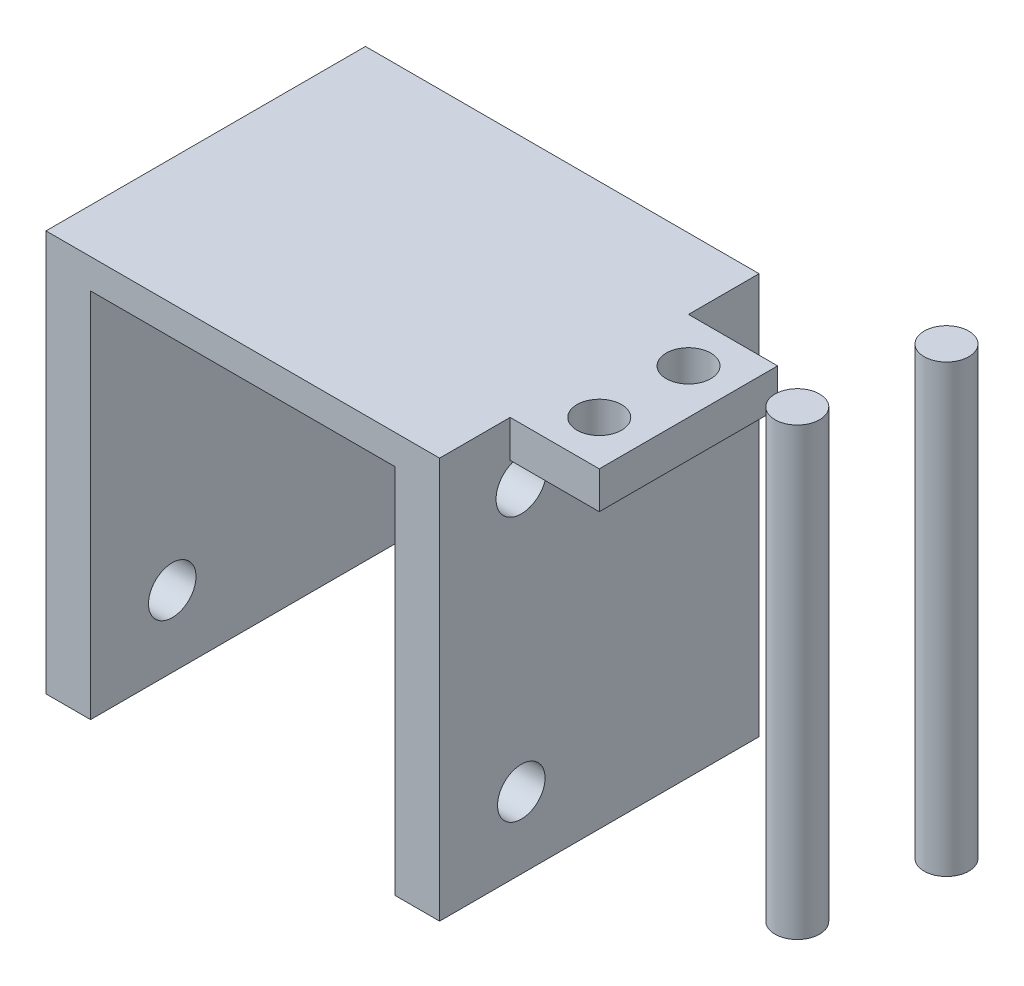
ISO-10303-21;
HEADER;
FILE_DESCRIPTION(('STEP AP214'),'2;1');
FILE_NAME('part.step','',(''),(''),'','','');
FILE_SCHEMA(('AUTOMOTIVE_DESIGN { 1 0 10303 214 1 1 1 1 }'));
ENDSEC;
DATA;
#1=APPLICATION_CONTEXT('core data for automotive mechanical design processes');
#2=APPLICATION_PROTOCOL_DEFINITION('international standard','automotive_design',2000,#1);
#3=PRODUCT_CONTEXT('',#1,'mechanical');
#4=PRODUCT('Part','Part','',(#3));
#5=PRODUCT_RELATED_PRODUCT_CATEGORY('part','',(#4));
#6=PRODUCT_DEFINITION_FORMATION('','',#4);
#7=PRODUCT_DEFINITION_CONTEXT('part definition',#1,'design');
#8=PRODUCT_DEFINITION('design','',#6,#7);
#9=PRODUCT_DEFINITION_SHAPE('','',#8);
#10=(LENGTH_UNIT() NAMED_UNIT(*) SI_UNIT(.MILLI.,.METRE.));
#11=(NAMED_UNIT(*) PLANE_ANGLE_UNIT() SI_UNIT($,.RADIAN.));
#12=(NAMED_UNIT(*) SI_UNIT($,.STERADIAN.) SOLID_ANGLE_UNIT());
#13=UNCERTAINTY_MEASURE_WITH_UNIT(LENGTH_MEASURE(1.E-05),#10,'distance_accuracy_value','');
#14=(GEOMETRIC_REPRESENTATION_CONTEXT(3) GLOBAL_UNCERTAINTY_ASSIGNED_CONTEXT((#13)) GLOBAL_UNIT_ASSIGNED_CONTEXT((#10,
#11,#12)) REPRESENTATION_CONTEXT('',''));
#15=CARTESIAN_POINT('',(0.,0.,0.));
#16=DIRECTION('',(0.,0.,1.));
#17=DIRECTION('',(1.,0.,0.));
#18=AXIS2_PLACEMENT_3D('',#15,#16,#17);
#19=CARTESIAN_POINT('',(-63.946767990082,-37.9640136599524,21.6698122934481));
#20=DIRECTION('',(0.,1.,0.));
#21=DIRECTION('',(-1.,0.,0.));
#22=AXIS2_PLACEMENT_3D('',#19,#20,#21);
#23=CYLINDRICAL_SURFACE('',#22,1.5);
#24=CARTESIAN_POINT('',(-63.946767990082,-37.9640136599524,21.6698122934481));
#25=DIRECTION('',(0.,1.,0.));
#26=DIRECTION('',(-1.,0.,0.));
#27=AXIS2_PLACEMENT_3D('',#24,#25,#26);
#28=CIRCLE('',#27,1.5);
#29=CARTESIAN_POINT('',(-65.446767990082,-37.9640136599524,21.6698122934481));
#30=VERTEX_POINT('',#29);
#31=EDGE_CURVE('E54',#30,#30,#28,.T.);
#32=ORIENTED_EDGE('',*,*,#31,.T.);
#33=EDGE_LOOP('',(#32));
#34=FACE_BOUND('',#33,.T.);
#35=CARTESIAN_POINT('',(-63.946767990082,-7.96401365995245,21.6698122934481));
#36=DIRECTION('',(0.,1.,0.));
#37=DIRECTION('',(-1.,0.,0.));
#38=AXIS2_PLACEMENT_3D('',#35,#36,#37);
#39=CIRCLE('',#38,1.5);
#40=CARTESIAN_POINT('',(-65.446767990082,-7.96401365995245,21.6698122934481));
#41=VERTEX_POINT('',#40);
#42=EDGE_CURVE('E11',#41,#41,#39,.T.);
#43=ORIENTED_EDGE('',*,*,#42,.F.);
#44=EDGE_LOOP('',(#43));
#45=FACE_BOUND('',#44,.T.);
#46=ADVANCED_FACE('F50',(#34,#45),#23,.T.);
#47=CARTESIAN_POINT('',(-63.946767990082,-37.9640136599524,21.6698122934481));
#48=DIRECTION('',(0.,1.,0.));
#49=DIRECTION('',(-1.,0.,0.));
#50=AXIS2_PLACEMENT_3D('',#47,#48,#49);
#51=PLANE('',#50);
#52=ORIENTED_EDGE('',*,*,#31,.F.);
#53=EDGE_LOOP('',(#52));
#54=FACE_BOUND('',#53,.T.);
#55=ADVANCED_FACE('F52',(#54),#51,.F.);
#56=CARTESIAN_POINT('',(-63.946767990082,-7.96401365995245,21.6698122934481));
#57=DIRECTION('',(0.,1.,0.));
#58=DIRECTION('',(-1.,0.,0.));
#59=AXIS2_PLACEMENT_3D('',#56,#57,#58);
#60=PLANE('',#59);
#61=ORIENTED_EDGE('',*,*,#42,.T.);
#62=EDGE_LOOP('',(#61));
#63=FACE_BOUND('',#62,.T.);
#64=ADVANCED_FACE('F68',(#63),#60,.T.);
#65=CLOSED_SHELL('',(#46,#55,#64));
#66=MANIFOLD_SOLID_BREP('B2',#65);
#67=CARTESIAN_POINT('',(-62.5970607031139,-37.9640136599524,12.9739899007783));
#68=DIRECTION('',(0.,1.,0.));
#69=DIRECTION('',(-1.,0.,0.));
#70=AXIS2_PLACEMENT_3D('',#67,#68,#69);
#71=CYLINDRICAL_SURFACE('',#70,1.5);
#72=CARTESIAN_POINT('',(-62.5970607031139,-37.9640136599524,12.9739899007783));
#73=DIRECTION('',(0.,1.,0.));
#74=DIRECTION('',(-1.,0.,0.));
#75=AXIS2_PLACEMENT_3D('',#72,#73,#74);
#76=CIRCLE('',#75,1.5);
#77=CARTESIAN_POINT('',(-64.0970607031139,-37.9640136599524,12.9739899007783));
#78=VERTEX_POINT('',#77);
#79=EDGE_CURVE('E49',#78,#78,#76,.T.);
#80=ORIENTED_EDGE('',*,*,#79,.T.);
#81=EDGE_LOOP('',(#80));
#82=FACE_BOUND('',#81,.T.);
#83=CARTESIAN_POINT('',(-62.5970607031139,-7.96401365995245,12.9739899007783));
#84=DIRECTION('',(0.,1.,0.));
#85=DIRECTION('',(-1.,0.,0.));
#86=AXIS2_PLACEMENT_3D('',#83,#84,#85);
#87=CIRCLE('',#86,1.5);
#88=CARTESIAN_POINT('',(-64.0970607031139,-7.96401365995245,12.9739899007783));
#89=VERTEX_POINT('',#88);
#90=EDGE_CURVE('E108',#89,#89,#87,.T.);
#91=ORIENTED_EDGE('',*,*,#90,.F.);
#92=EDGE_LOOP('',(#91));
#93=FACE_BOUND('',#92,.T.);
#94=ADVANCED_FACE('F105',(#82,#93),#71,.T.);
#95=CARTESIAN_POINT('',(-62.5970607031139,-37.9640136599524,12.9739899007783));
#96=DIRECTION('',(0.,1.,0.));
#97=DIRECTION('',(-1.,0.,0.));
#98=AXIS2_PLACEMENT_3D('',#95,#96,#97);
#99=PLANE('',#98);
#100=ORIENTED_EDGE('',*,*,#79,.F.);
#101=EDGE_LOOP('',(#100));
#102=FACE_BOUND('',#101,.T.);
#103=ADVANCED_FACE('F122',(#102),#99,.F.);
#104=CARTESIAN_POINT('',(-62.5970607031139,-7.96401365995245,12.9739899007783));
#105=DIRECTION('',(0.,1.,0.));
#106=DIRECTION('',(-1.,0.,0.));
#107=AXIS2_PLACEMENT_3D('',#104,#105,#106);
#108=PLANE('',#107);
#109=ORIENTED_EDGE('',*,*,#90,.T.);
#110=EDGE_LOOP('',(#109));
#111=FACE_BOUND('',#110,.T.);
#112=ADVANCED_FACE('F119',(#111),#108,.T.);
#113=CLOSED_SHELL('',(#94,#103,#112));
#114=MANIFOLD_SOLID_BREP('B6',#113);
#115=CARTESIAN_POINT('',(-72.9993615241813,-34.9640136599524,36.7));
#116=DIRECTION('',(-1.,0.,0.));
#117=DIRECTION('',(0.,0.,1.));
#118=AXIS2_PLACEMENT_3D('',#115,#116,#117);
#119=PLANE('',#118);
#120=CARTESIAN_POINT('',(-72.9993615241813,-30.1640136599525,31.2));
#121=DIRECTION('',(1.,0.,0.));
#122=DIRECTION('',(0.,0.,-1.));
#123=AXIS2_PLACEMENT_3D('',#120,#121,#122);
#124=CIRCLE('',#123,1.6);
#125=CARTESIAN_POINT('',(-72.9993615241813,-30.1640136599525,29.6));
#126=VERTEX_POINT('',#125);
#127=EDGE_CURVE('E315',#126,#126,#124,.T.);
#128=ORIENTED_EDGE('',*,*,#127,.F.);
#129=EDGE_LOOP('',(#128));
#130=FACE_BOUND('',#129,.T.);
#131=CARTESIAN_POINT('',(-72.9993615241813,-12.2640136599525,31.2));
#132=DIRECTION('',(1.,0.,0.));
#133=DIRECTION('',(0.,0.,-1.));
#134=AXIS2_PLACEMENT_3D('',#131,#132,#133);
#135=CIRCLE('',#134,1.7);
#136=CARTESIAN_POINT('',(-72.9993615241813,-12.2640136599525,29.5));
#137=VERTEX_POINT('',#136);
#138=EDGE_CURVE('E316',#137,#137,#135,.T.);
#139=ORIENTED_EDGE('',*,*,#138,.F.);
#140=EDGE_LOOP('',(#139));
#141=FACE_BOUND('',#140,.T.);
#142=DIRECTION('',(0.,1.,0.));
#143=VECTOR('',#142,1.);
#144=CARTESIAN_POINT('',(-72.9993615241813,-10.4640136599525,19.9414487752555));
#145=LINE('',#144,#143);
#146=CARTESIAN_POINT('',(-72.9993615241813,-10.4640136599525,19.9414487752555));
#147=VERTEX_POINT('',#146);
#148=CARTESIAN_POINT('',(-72.9993615241813,-7.96401365995246,19.9414487752555));
#149=VERTEX_POINT('',#148);
#150=EDGE_CURVE('E252',#147,#149,#145,.T.);
#151=ORIENTED_EDGE('',*,*,#150,.F.);
#152=DIRECTION('',(0.,0.,1.));
#153=VECTOR('',#152,1.);
#154=CARTESIAN_POINT('',(-72.9993615241813,-10.4640136599525,19.9414487752555));
#155=LINE('',#154,#153);
#156=CARTESIAN_POINT('',(-72.9993615241813,-10.4640136599525,31.95));
#157=VERTEX_POINT('',#156);
#158=EDGE_CURVE('E262',#147,#157,#155,.T.);
#159=ORIENTED_EDGE('',*,*,#158,.T.);
#160=DIRECTION('',(0.,1.,0.));
#161=VECTOR('',#160,1.);
#162=CARTESIAN_POINT('',(-72.9993615241813,-10.4640136599525,31.95));
#163=LINE('',#162,#161);
#164=CARTESIAN_POINT('',(-72.9993615241813,-7.96401365995246,31.95));
#165=VERTEX_POINT('',#164);
#166=EDGE_CURVE('E290',#157,#165,#163,.T.);
#167=ORIENTED_EDGE('',*,*,#166,.T.);
#168=DIRECTION('',(0.,0.,-1.));
#169=VECTOR('',#168,1.);
#170=CARTESIAN_POINT('',(-72.9993615241813,-7.96401365995246,36.7));
#171=LINE('',#170,#169);
#172=CARTESIAN_POINT('',(-72.9993615241813,-7.96401365995246,36.7));
#173=VERTEX_POINT('',#172);
#174=EDGE_CURVE('E387',#173,#165,#171,.T.);
#175=ORIENTED_EDGE('',*,*,#174,.F.);
#176=DIRECTION('',(0.,1.,0.));
#177=VECTOR('',#176,1.);
#178=CARTESIAN_POINT('',(-72.9993615241813,-34.9640136599524,36.7));
#179=LINE('',#178,#177);
#180=CARTESIAN_POINT('',(-72.9993615241813,-34.9640136599524,36.7));
#181=VERTEX_POINT('',#180);
#182=EDGE_CURVE('E377',#181,#173,#179,.T.);
#183=ORIENTED_EDGE('',*,*,#182,.F.);
#184=DIRECTION('',(0.,0.,-1.));
#185=VECTOR('',#184,1.);
#186=CARTESIAN_POINT('',(-72.9993615241813,-34.9640136599524,36.7));
#187=LINE('',#186,#185);
#188=CARTESIAN_POINT('',(-72.9993615241813,-34.9640136599525,15.1914487752555));
#189=VERTEX_POINT('',#188);
#190=EDGE_CURVE('E391',#181,#189,#187,.T.);
#191=ORIENTED_EDGE('',*,*,#190,.T.);
#192=DIRECTION('',(0.,1.,0.));
#193=VECTOR('',#192,1.);
#194=CARTESIAN_POINT('',(-72.9993615241813,-34.9640136599524,15.1914487752555));
#195=LINE('',#194,#193);
#196=CARTESIAN_POINT('',(-72.9993615241813,-7.96401365995246,15.1914487752555));
#197=VERTEX_POINT('',#196);
#198=EDGE_CURVE('E311',#189,#197,#195,.T.);
#199=ORIENTED_EDGE('',*,*,#198,.T.);
#200=EDGE_CURVE('E386',#149,#197,#171,.T.);
#201=ORIENTED_EDGE('',*,*,#200,.F.);
#202=EDGE_LOOP('',(#151,#159,#167,#175,#183,#191,#199,#201));
#203=FACE_BOUND('',#202,.T.);
#204=ADVANCED_FACE('F151',(#130,#141,#203),#119,.F.);
#205=CARTESIAN_POINT('',(-99.4993615241813,-34.9640136599525,36.7));
#206=DIRECTION('',(1.,0.,0.));
#207=DIRECTION('',(0.,1.,0.));
#208=AXIS2_PLACEMENT_3D('',#205,#206,#207);
#209=PLANE('',#208);
#210=CARTESIAN_POINT('',(-99.4993615241813,-30.1640136599525,31.2));
#211=DIRECTION('',(1.,0.,0.));
#212=DIRECTION('',(0.,1.,0.));
#213=AXIS2_PLACEMENT_3D('',#210,#211,#212);
#214=CIRCLE('',#213,1.6);
#215=CARTESIAN_POINT('',(-99.4993615241813,-28.5640136599525,31.2));
#216=VERTEX_POINT('',#215);
#217=EDGE_CURVE('E328',#216,#216,#214,.T.);
#218=ORIENTED_EDGE('',*,*,#217,.T.);
#219=EDGE_LOOP('',(#218));
#220=FACE_BOUND('',#219,.T.);
#221=DIRECTION('',(0.,0.,-1.));
#222=VECTOR('',#221,1.);
#223=CARTESIAN_POINT('',(-99.4993615241813,-7.96401365995246,36.7));
#224=LINE('',#223,#222);
#225=CARTESIAN_POINT('',(-99.4993615241813,-7.96401365995246,36.7));
#226=VERTEX_POINT('',#225);
#227=CARTESIAN_POINT('',(-99.4993615241813,-7.96401365995246,15.1914487752555));
#228=VERTEX_POINT('',#227);
#229=EDGE_CURVE('E383',#226,#228,#224,.T.);
#230=ORIENTED_EDGE('',*,*,#229,.T.);
#231=DIRECTION('',(0.,1.,0.));
#232=VECTOR('',#231,1.);
#233=CARTESIAN_POINT('',(-99.4993615241813,-34.9640136599525,15.1914487752555));
#234=LINE('',#233,#232);
#235=CARTESIAN_POINT('',(-99.4993615241813,-34.9640136599525,15.1914487752555));
#236=VERTEX_POINT('',#235);
#237=EDGE_CURVE('E289',#236,#228,#234,.T.);
#238=ORIENTED_EDGE('',*,*,#237,.F.);
#239=DIRECTION('',(0.,0.,-1.));
#240=VECTOR('',#239,1.);
#241=CARTESIAN_POINT('',(-99.4993615241813,-34.9640136599525,36.7));
#242=LINE('',#241,#240);
#243=CARTESIAN_POINT('',(-99.4993615241813,-34.9640136599525,36.7));
#244=VERTEX_POINT('',#243);
#245=EDGE_CURVE('E160',#244,#236,#242,.T.);
#246=ORIENTED_EDGE('',*,*,#245,.F.);
#247=DIRECTION('',(0.,-1.,0.));
#248=VECTOR('',#247,1.);
#249=CARTESIAN_POINT('',(-99.4993615241813,-34.9640136599525,36.7));
#250=LINE('',#249,#248);
#251=EDGE_CURVE('E358',#226,#244,#250,.T.);
#252=ORIENTED_EDGE('',*,*,#251,.F.);
#253=EDGE_LOOP('',(#230,#238,#246,#252));
#254=FACE_BOUND('',#253,.T.);
#255=CARTESIAN_POINT('',(-99.4993615241813,-12.2640136599525,31.2));
#256=DIRECTION('',(1.,0.,0.));
#257=DIRECTION('',(0.,1.,0.));
#258=AXIS2_PLACEMENT_3D('',#255,#256,#257);
#259=CIRCLE('',#258,1.7);
#260=CARTESIAN_POINT('',(-99.4993615241813,-10.5640136599525,31.2));
#261=VERTEX_POINT('',#260);
#262=EDGE_CURVE('E337',#261,#261,#259,.T.);
#263=ORIENTED_EDGE('',*,*,#262,.T.);
#264=EDGE_LOOP('',(#263));
#265=FACE_BOUND('',#264,.T.);
#266=ADVANCED_FACE('F153',(#220,#254,#265),#209,.F.);
#267=CARTESIAN_POINT('',(-72.9993615241813,-34.9640136599524,36.7));
#268=DIRECTION('',(0.,1.,0.));
#269=DIRECTION('',(-1.,0.,0.));
#270=AXIS2_PLACEMENT_3D('',#267,#268,#269);
#271=PLANE('',#270);
#272=DIRECTION('',(0.,0.,-1.));
#273=VECTOR('',#272,1.);
#274=CARTESIAN_POINT('',(-75.9993615241813,-34.9640136599525,36.7));
#275=LINE('',#274,#273);
#276=CARTESIAN_POINT('',(-75.9993615241813,-34.9640136599525,36.7));
#277=VERTEX_POINT('',#276);
#278=CARTESIAN_POINT('',(-75.9993615241813,-34.9640136599525,15.1914487752555));
#279=VERTEX_POINT('',#278);
#280=EDGE_CURVE('E353',#277,#279,#275,.T.);
#281=ORIENTED_EDGE('',*,*,#280,.T.);
#282=DIRECTION('',(-1.,0.,0.));
#283=VECTOR('',#282,1.);
#284=CARTESIAN_POINT('',(-67.4993615241813,-34.9640136599525,15.1914487752555));
#285=LINE('',#284,#283);
#286=EDGE_CURVE('E300',#189,#279,#285,.T.);
#287=ORIENTED_EDGE('',*,*,#286,.F.);
#288=ORIENTED_EDGE('',*,*,#190,.F.);
#289=DIRECTION('',(1.,0.,0.));
#290=VECTOR('',#289,1.);
#291=CARTESIAN_POINT('',(-72.9993615241813,-34.9640136599524,36.7));
#292=LINE('',#291,#290);
#293=EDGE_CURVE('E372',#277,#181,#292,.T.);
#294=ORIENTED_EDGE('',*,*,#293,.F.);
#295=EDGE_LOOP('',(#281,#287,#288,#294));
#296=FACE_BOUND('',#295,.T.);
#297=ADVANCED_FACE('F417',(#296),#271,.F.);
#298=ORIENTED_EDGE('',*,*,#245,.T.);
#299=CARTESIAN_POINT('',(-96.4993615241813,-34.9640136599525,15.1914487752555));
#300=VERTEX_POINT('',#299);
#301=EDGE_CURVE('E297',#300,#236,#285,.T.);
#302=ORIENTED_EDGE('',*,*,#301,.F.);
#303=DIRECTION('',(0.,0.,-1.));
#304=VECTOR('',#303,1.);
#305=CARTESIAN_POINT('',(-96.4993615241813,-34.9640136599525,36.7));
#306=LINE('',#305,#304);
#307=CARTESIAN_POINT('',(-96.4993615241813,-34.9640136599525,36.7));
#308=VERTEX_POINT('',#307);
#309=EDGE_CURVE('E362',#308,#300,#306,.T.);
#310=ORIENTED_EDGE('',*,*,#309,.F.);
#311=EDGE_CURVE('E373',#244,#308,#292,.T.);
#312=ORIENTED_EDGE('',*,*,#311,.F.);
#313=EDGE_LOOP('',(#298,#302,#310,#312));
#314=FACE_BOUND('',#313,.T.);
#315=ADVANCED_FACE('F422',(#314),#271,.F.);
#316=CARTESIAN_POINT('',(-72.9993615241813,-7.96401365995246,36.7));
#317=DIRECTION('',(0.,-1.,0.));
#318=DIRECTION('',(1.,0.,0.));
#319=AXIS2_PLACEMENT_3D('',#316,#317,#318);
#320=PLANE('',#319);
#321=DIRECTION('',(-1.,0.,0.));
#322=VECTOR('',#321,1.);
#323=CARTESIAN_POINT('',(-72.9993615241813,-7.96401365995246,15.1914487752555));
#324=LINE('',#323,#322);
#325=EDGE_CURVE('E307',#197,#228,#324,.T.);
#326=ORIENTED_EDGE('',*,*,#325,.T.);
#327=ORIENTED_EDGE('',*,*,#229,.F.);
#328=DIRECTION('',(-1.,0.,0.));
#329=VECTOR('',#328,1.);
#330=CARTESIAN_POINT('',(-72.9993615241813,-7.96401365995246,36.7));
#331=LINE('',#330,#329);
#332=EDGE_CURVE('E380',#173,#226,#331,.T.);
#333=ORIENTED_EDGE('',*,*,#332,.F.);
#334=ORIENTED_EDGE('',*,*,#174,.T.);
#335=DIRECTION('',(1.,0.,0.));
#336=VECTOR('',#335,1.);
#337=CARTESIAN_POINT('',(-72.9993615241813,-7.96401365995246,31.95));
#338=LINE('',#337,#336);
#339=CARTESIAN_POINT('',(-66.9993615241813,-7.96401365995245,31.95));
#340=VERTEX_POINT('',#339);
#341=EDGE_CURVE('E167',#165,#340,#338,.T.);
#342=ORIENTED_EDGE('',*,*,#341,.T.);
#343=DIRECTION('',(0.,0.,-1.));
#344=VECTOR('',#343,1.);
#345=CARTESIAN_POINT('',(-66.9993615241813,-7.96401365995245,19.9414487752555));
#346=LINE('',#345,#344);
#347=CARTESIAN_POINT('',(-66.9993615241813,-7.96401365995245,19.9414487752555));
#348=VERTEX_POINT('',#347);
#349=EDGE_CURVE('E281',#340,#348,#346,.T.);
#350=ORIENTED_EDGE('',*,*,#349,.T.);
#351=DIRECTION('',(-1.,0.,0.));
#352=VECTOR('',#351,1.);
#353=CARTESIAN_POINT('',(-72.9993615241813,-7.96401365995246,19.9414487752555));
#354=LINE('',#353,#352);
#355=EDGE_CURVE('E246',#348,#149,#354,.T.);
#356=ORIENTED_EDGE('',*,*,#355,.T.);
#357=ORIENTED_EDGE('',*,*,#200,.T.);
#358=EDGE_LOOP('',(#326,#327,#333,#334,#342,#350,#356,#357));
#359=FACE_BOUND('',#358,.T.);
#360=CARTESIAN_POINT('',(-69.9993615241813,-7.96401365995245,28.95));
#361=DIRECTION('',(0.,1.,0.));
#362=DIRECTION('',(-1.,0.,0.));
#363=AXIS2_PLACEMENT_3D('',#360,#361,#362);
#364=CIRCLE('',#363,1.5);
#365=CARTESIAN_POINT('',(-71.4993615241813,-7.96401365995245,28.95));
#366=VERTEX_POINT('',#365);
#367=EDGE_CURVE('E443',#366,#366,#364,.T.);
#368=ORIENTED_EDGE('',*,*,#367,.F.);
#369=EDGE_LOOP('',(#368));
#370=FACE_BOUND('',#369,.T.);
#371=CARTESIAN_POINT('',(-69.9993615241813,-7.96401365995245,22.9414487752555));
#372=DIRECTION('',(0.,1.,0.));
#373=DIRECTION('',(-1.,0.,0.));
#374=AXIS2_PLACEMENT_3D('',#371,#372,#373);
#375=CIRCLE('',#374,1.5);
#376=CARTESIAN_POINT('',(-71.4993615241813,-7.96401365995245,22.9414487752555));
#377=VERTEX_POINT('',#376);
#378=EDGE_CURVE('E274',#377,#377,#375,.T.);
#379=ORIENTED_EDGE('',*,*,#378,.F.);
#380=EDGE_LOOP('',(#379));
#381=FACE_BOUND('',#380,.T.);
#382=ADVANCED_FACE('F437',(#359,#370,#381),#320,.F.);
#383=CARTESIAN_POINT('',(-70.8216288286792,0.,36.7));
#384=DIRECTION('',(0.,0.,1.));
#385=DIRECTION('',(1.,0.,0.));
#386=AXIS2_PLACEMENT_3D('',#383,#384,#385);
#387=PLANE('',#386);
#388=DIRECTION('',(0.,-1.,0.));
#389=VECTOR('',#388,1.);
#390=CARTESIAN_POINT('',(-75.9993615241813,-34.9640136599525,36.7));
#391=LINE('',#390,#389);
#392=CARTESIAN_POINT('',(-75.9993615241813,-9.96401365995246,36.7));
#393=VERTEX_POINT('',#392);
#394=EDGE_CURVE('E341',#393,#277,#391,.T.);
#395=ORIENTED_EDGE('',*,*,#394,.T.);
#396=ORIENTED_EDGE('',*,*,#293,.T.);
#397=ORIENTED_EDGE('',*,*,#182,.T.);
#398=ORIENTED_EDGE('',*,*,#332,.T.);
#399=ORIENTED_EDGE('',*,*,#251,.T.);
#400=ORIENTED_EDGE('',*,*,#311,.T.);
#401=DIRECTION('',(0.,1.,0.));
#402=VECTOR('',#401,1.);
#403=CARTESIAN_POINT('',(-96.4993615241813,-34.9640136599525,36.7));
#404=LINE('',#403,#402);
#405=CARTESIAN_POINT('',(-96.4993615241813,-9.96401365995246,36.7));
#406=VERTEX_POINT('',#405);
#407=EDGE_CURVE('E345',#308,#406,#404,.T.);
#408=ORIENTED_EDGE('',*,*,#407,.T.);
#409=DIRECTION('',(1.,0.,0.));
#410=VECTOR('',#409,1.);
#411=CARTESIAN_POINT('',(-96.4993615241813,-9.96401365995246,36.7));
#412=LINE('',#411,#410);
#413=EDGE_CURVE('E349',#406,#393,#412,.T.);
#414=ORIENTED_EDGE('',*,*,#413,.T.);
#415=EDGE_LOOP('',(#395,#396,#397,#398,#399,#400,#408,#414));
#416=FACE_BOUND('',#415,.T.);
#417=ADVANCED_FACE('F466',(#416),#387,.T.);
#418=CARTESIAN_POINT('',(-75.9993615241813,-34.9640136599525,36.7));
#419=DIRECTION('',(1.,0.,0.));
#420=DIRECTION('',(0.,0.,-1.));
#421=AXIS2_PLACEMENT_3D('',#418,#419,#420);
#422=PLANE('',#421);
#423=CARTESIAN_POINT('',(-75.9993615241813,-12.2640136599525,31.2));
#424=DIRECTION('',(1.,0.,0.));
#425=DIRECTION('',(0.,0.,-1.));
#426=AXIS2_PLACEMENT_3D('',#423,#424,#425);
#427=CIRCLE('',#426,1.7);
#428=CARTESIAN_POINT('',(-75.9993615241813,-12.2640136599525,29.5));
#429=VERTEX_POINT('',#428);
#430=EDGE_CURVE('E333',#429,#429,#427,.T.);
#431=ORIENTED_EDGE('',*,*,#430,.T.);
#432=EDGE_LOOP('',(#431));
#433=FACE_BOUND('',#432,.T.);
#434=CARTESIAN_POINT('',(-75.9993615241813,-30.1640136599525,31.2));
#435=DIRECTION('',(1.,0.,0.));
#436=DIRECTION('',(0.,0.,-1.));
#437=AXIS2_PLACEMENT_3D('',#434,#435,#436);
#438=CIRCLE('',#437,1.6);
#439=CARTESIAN_POINT('',(-75.9993615241813,-30.1640136599525,29.6));
#440=VERTEX_POINT('',#439);
#441=EDGE_CURVE('E324',#440,#440,#438,.T.);
#442=ORIENTED_EDGE('',*,*,#441,.T.);
#443=EDGE_LOOP('',(#442));
#444=FACE_BOUND('',#443,.T.);
#445=DIRECTION('',(0.,0.,-1.));
#446=VECTOR('',#445,1.);
#447=CARTESIAN_POINT('',(-75.9993615241813,-9.96401365995246,36.7));
#448=LINE('',#447,#446);
#449=CARTESIAN_POINT('',(-75.9993615241813,-9.96401365995246,15.1914487752555));
#450=VERTEX_POINT('',#449);
#451=EDGE_CURVE('E354',#393,#450,#448,.T.);
#452=ORIENTED_EDGE('',*,*,#451,.T.);
#453=DIRECTION('',(0.,-1.,0.));
#454=VECTOR('',#453,1.);
#455=CARTESIAN_POINT('',(-75.9993615241813,-34.9640136599525,15.1914487752555));
#456=LINE('',#455,#454);
#457=EDGE_CURVE('E303',#450,#279,#456,.T.);
#458=ORIENTED_EDGE('',*,*,#457,.T.);
#459=ORIENTED_EDGE('',*,*,#280,.F.);
#460=ORIENTED_EDGE('',*,*,#394,.F.);
#461=EDGE_LOOP('',(#452,#458,#459,#460));
#462=FACE_BOUND('',#461,.T.);
#463=ADVANCED_FACE('F493',(#433,#444,#462),#422,.F.);
#464=CARTESIAN_POINT('',(-96.4993615241813,-9.96401365995246,36.7));
#465=DIRECTION('',(0.,1.,0.));
#466=DIRECTION('',(-1.,0.,0.));
#467=AXIS2_PLACEMENT_3D('',#464,#465,#466);
#468=PLANE('',#467);
#469=DIRECTION('',(0.,0.,-1.));
#470=VECTOR('',#469,1.);
#471=CARTESIAN_POINT('',(-96.4993615241813,-9.96401365995246,36.7));
#472=LINE('',#471,#470);
#473=CARTESIAN_POINT('',(-96.4993615241813,-9.96401365995246,15.1914487752555));
#474=VERTEX_POINT('',#473);
#475=EDGE_CURVE('E359',#406,#474,#472,.T.);
#476=ORIENTED_EDGE('',*,*,#475,.T.);
#477=DIRECTION('',(1.,0.,0.));
#478=VECTOR('',#477,1.);
#479=CARTESIAN_POINT('',(-96.4993615241813,-9.96401365995246,15.1914487752555));
#480=LINE('',#479,#478);
#481=EDGE_CURVE('E175',#474,#450,#480,.T.);
#482=ORIENTED_EDGE('',*,*,#481,.T.);
#483=ORIENTED_EDGE('',*,*,#451,.F.);
#484=ORIENTED_EDGE('',*,*,#413,.F.);
#485=EDGE_LOOP('',(#476,#482,#483,#484));
#486=FACE_BOUND('',#485,.T.);
#487=ADVANCED_FACE('F490',(#486),#468,.F.);
#488=CARTESIAN_POINT('',(-96.4993615241813,-34.9640136599525,36.7));
#489=DIRECTION('',(-1.,0.,0.));
#490=DIRECTION('',(0.,0.,1.));
#491=AXIS2_PLACEMENT_3D('',#488,#489,#490);
#492=PLANE('',#491);
#493=CARTESIAN_POINT('',(-96.4993615241813,-12.2640136599525,31.2));
#494=DIRECTION('',(-1.,0.,0.));
#495=DIRECTION('',(0.,0.,1.));
#496=AXIS2_PLACEMENT_3D('',#493,#494,#495);
#497=CIRCLE('',#496,1.7);
#498=CARTESIAN_POINT('',(-96.4993615241813,-12.2640136599525,32.9));
#499=VERTEX_POINT('',#498);
#500=EDGE_CURVE('E332',#499,#499,#497,.T.);
#501=ORIENTED_EDGE('',*,*,#500,.T.);
#502=EDGE_LOOP('',(#501));
#503=FACE_BOUND('',#502,.T.);
#504=CARTESIAN_POINT('',(-96.4993615241813,-30.1640136599525,31.2));
#505=DIRECTION('',(-1.,0.,0.));
#506=DIRECTION('',(0.,0.,1.));
#507=AXIS2_PLACEMENT_3D('',#504,#505,#506);
#508=CIRCLE('',#507,1.6);
#509=CARTESIAN_POINT('',(-96.4993615241813,-30.1640136599525,32.8));
#510=VERTEX_POINT('',#509);
#511=EDGE_CURVE('E320',#510,#510,#508,.T.);
#512=ORIENTED_EDGE('',*,*,#511,.T.);
#513=EDGE_LOOP('',(#512));
#514=FACE_BOUND('',#513,.T.);
#515=ORIENTED_EDGE('',*,*,#309,.T.);
#516=DIRECTION('',(0.,1.,0.));
#517=VECTOR('',#516,1.);
#518=CARTESIAN_POINT('',(-96.4993615241813,-34.9640136599525,15.1914487752555));
#519=LINE('',#518,#517);
#520=EDGE_CURVE('E103',#300,#474,#519,.T.);
#521=ORIENTED_EDGE('',*,*,#520,.T.);
#522=ORIENTED_EDGE('',*,*,#475,.F.);
#523=ORIENTED_EDGE('',*,*,#407,.F.);
#524=EDGE_LOOP('',(#515,#521,#522,#523));
#525=FACE_BOUND('',#524,.T.);
#526=ADVANCED_FACE('F404',(#503,#514,#525),#492,.F.);
#527=CARTESIAN_POINT('',(-109.699361524181,-30.1640136599525,31.2));
#528=DIRECTION('',(1.,0.,0.));
#529=DIRECTION('',(0.,0.,-1.));
#530=AXIS2_PLACEMENT_3D('',#527,#528,#529);
#531=CYLINDRICAL_SURFACE('',#530,1.6);
#532=ORIENTED_EDGE('',*,*,#511,.F.);
#533=EDGE_LOOP('',(#532));
#534=FACE_BOUND('',#533,.T.);
#535=ORIENTED_EDGE('',*,*,#217,.F.);
#536=EDGE_LOOP('',(#535));
#537=FACE_BOUND('',#536,.T.);
#538=ADVANCED_FACE('F411',(#534,#537),#531,.F.);
#539=CARTESIAN_POINT('',(-109.699361524181,-12.2640136599525,31.2));
#540=DIRECTION('',(1.,0.,0.));
#541=DIRECTION('',(0.,0.,-1.));
#542=AXIS2_PLACEMENT_3D('',#539,#540,#541);
#543=CYLINDRICAL_SURFACE('',#542,1.7);
#544=ORIENTED_EDGE('',*,*,#500,.F.);
#545=EDGE_LOOP('',(#544));
#546=FACE_BOUND('',#545,.T.);
#547=ORIENTED_EDGE('',*,*,#262,.F.);
#548=EDGE_LOOP('',(#547));
#549=FACE_BOUND('',#548,.T.);
#550=ADVANCED_FACE('F407',(#546,#549),#543,.F.);
#551=ORIENTED_EDGE('',*,*,#127,.T.);
#552=EDGE_LOOP('',(#551));
#553=FACE_BOUND('',#552,.T.);
#554=ORIENTED_EDGE('',*,*,#441,.F.);
#555=EDGE_LOOP('',(#554));
#556=FACE_BOUND('',#555,.T.);
#557=ADVANCED_FACE('F410',(#553,#556),#531,.F.);
#558=ORIENTED_EDGE('',*,*,#138,.T.);
#559=EDGE_LOOP('',(#558));
#560=FACE_BOUND('',#559,.T.);
#561=ORIENTED_EDGE('',*,*,#430,.F.);
#562=EDGE_LOOP('',(#561));
#563=FACE_BOUND('',#562,.T.);
#564=ADVANCED_FACE('F413',(#560,#563),#543,.F.);
#565=CARTESIAN_POINT('',(-67.4993615241813,-34.9640136599525,15.1914487752555));
#566=DIRECTION('',(0.,0.,1.));
#567=DIRECTION('',(1.,0.,0.));
#568=AXIS2_PLACEMENT_3D('',#565,#566,#567);
#569=PLANE('',#568);
#570=ORIENTED_EDGE('',*,*,#286,.T.);
#571=ORIENTED_EDGE('',*,*,#457,.F.);
#572=ORIENTED_EDGE('',*,*,#481,.F.);
#573=ORIENTED_EDGE('',*,*,#520,.F.);
#574=ORIENTED_EDGE('',*,*,#301,.T.);
#575=ORIENTED_EDGE('',*,*,#237,.T.);
#576=ORIENTED_EDGE('',*,*,#325,.F.);
#577=ORIENTED_EDGE('',*,*,#198,.F.);
#578=EDGE_LOOP('',(#570,#571,#572,#573,#574,#575,#576,#577));
#579=FACE_BOUND('',#578,.T.);
#580=ADVANCED_FACE('F435',(#579),#569,.F.);
#581=CARTESIAN_POINT('',(-66.9993615241813,-10.4640136599525,19.9414487752555));
#582=DIRECTION('',(1.,0.,0.));
#583=DIRECTION('',(0.,1.,0.));
#584=AXIS2_PLACEMENT_3D('',#581,#582,#583);
#585=PLANE('',#584);
#586=ORIENTED_EDGE('',*,*,#349,.F.);
#587=DIRECTION('',(0.,1.,0.));
#588=VECTOR('',#587,1.);
#589=CARTESIAN_POINT('',(-66.9993615241813,-10.4640136599525,31.95));
#590=LINE('',#589,#588);
#591=CARTESIAN_POINT('',(-66.9993615241813,-10.4640136599525,31.95));
#592=VERTEX_POINT('',#591);
#593=EDGE_CURVE('E266',#592,#340,#590,.T.);
#594=ORIENTED_EDGE('',*,*,#593,.F.);
#595=DIRECTION('',(0.,0.,-1.));
#596=VECTOR('',#595,1.);
#597=CARTESIAN_POINT('',(-66.9993615241813,-10.4640136599525,19.9414487752555));
#598=LINE('',#597,#596);
#599=CARTESIAN_POINT('',(-66.9993615241813,-10.4640136599525,19.9414487752555));
#600=VERTEX_POINT('',#599);
#601=EDGE_CURVE('E259',#592,#600,#598,.T.);
#602=ORIENTED_EDGE('',*,*,#601,.T.);
#603=DIRECTION('',(0.,1.,0.));
#604=VECTOR('',#603,1.);
#605=CARTESIAN_POINT('',(-66.9993615241813,-10.4640136599525,19.9414487752555));
#606=LINE('',#605,#604);
#607=EDGE_CURVE('E240',#600,#348,#606,.T.);
#608=ORIENTED_EDGE('',*,*,#607,.T.);
#609=EDGE_LOOP('',(#586,#594,#602,#608));
#610=FACE_BOUND('',#609,.T.);
#611=ADVANCED_FACE('F265',(#610),#585,.T.);
#612=CARTESIAN_POINT('',(-72.9993615241813,-10.4640136599525,31.95));
#613=DIRECTION('',(0.,0.,1.));
#614=DIRECTION('',(1.,0.,0.));
#615=AXIS2_PLACEMENT_3D('',#612,#613,#614);
#616=PLANE('',#615);
#617=ORIENTED_EDGE('',*,*,#341,.F.);
#618=ORIENTED_EDGE('',*,*,#166,.F.);
#619=DIRECTION('',(1.,0.,0.));
#620=VECTOR('',#619,1.);
#621=CARTESIAN_POINT('',(-72.9993615241813,-10.4640136599525,31.95));
#622=LINE('',#621,#620);
#623=EDGE_CURVE('E253',#157,#592,#622,.T.);
#624=ORIENTED_EDGE('',*,*,#623,.T.);
#625=ORIENTED_EDGE('',*,*,#593,.T.);
#626=EDGE_LOOP('',(#617,#618,#624,#625));
#627=FACE_BOUND('',#626,.T.);
#628=ADVANCED_FACE('F478',(#627),#616,.T.);
#629=CARTESIAN_POINT('',(-72.9993615241813,-10.4640136599525,19.9414487752555));
#630=DIRECTION('',(0.,0.,-1.));
#631=DIRECTION('',(-1.,0.,0.));
#632=AXIS2_PLACEMENT_3D('',#629,#630,#631);
#633=PLANE('',#632);
#634=ORIENTED_EDGE('',*,*,#355,.F.);
#635=ORIENTED_EDGE('',*,*,#607,.F.);
#636=DIRECTION('',(-1.,0.,0.));
#637=VECTOR('',#636,1.);
#638=CARTESIAN_POINT('',(-72.9993615241813,-10.4640136599525,19.9414487752555));
#639=LINE('',#638,#637);
#640=EDGE_CURVE('E243',#600,#147,#639,.T.);
#641=ORIENTED_EDGE('',*,*,#640,.T.);
#642=ORIENTED_EDGE('',*,*,#150,.T.);
#643=EDGE_LOOP('',(#634,#635,#641,#642));
#644=FACE_BOUND('',#643,.T.);
#645=ADVANCED_FACE('F242',(#644),#633,.T.);
#646=CARTESIAN_POINT('',(0.,-10.4640136599524,0.));
#647=DIRECTION('',(0.,1.,0.));
#648=DIRECTION('',(-1.,0.,0.));
#649=AXIS2_PLACEMENT_3D('',#646,#647,#648);
#650=PLANE('',#649);
#651=CARTESIAN_POINT('',(-69.9993615241813,-10.4640136599525,28.95));
#652=DIRECTION('',(0.,1.,0.));
#653=DIRECTION('',(-1.,0.,0.));
#654=AXIS2_PLACEMENT_3D('',#651,#652,#653);
#655=CIRCLE('',#654,1.5);
#656=CARTESIAN_POINT('',(-71.4993615241813,-10.4640136599525,28.95));
#657=VERTEX_POINT('',#656);
#658=EDGE_CURVE('E445',#657,#657,#655,.T.);
#659=ORIENTED_EDGE('',*,*,#658,.T.);
#660=EDGE_LOOP('',(#659));
#661=FACE_BOUND('',#660,.T.);
#662=CARTESIAN_POINT('',(-69.9993615241813,-10.4640136599525,22.9414487752555));
#663=DIRECTION('',(0.,1.,0.));
#664=DIRECTION('',(-1.,0.,0.));
#665=AXIS2_PLACEMENT_3D('',#662,#663,#664);
#666=CIRCLE('',#665,1.5);
#667=CARTESIAN_POINT('',(-71.4993615241813,-10.4640136599525,22.9414487752555));
#668=VERTEX_POINT('',#667);
#669=EDGE_CURVE('E284',#668,#668,#666,.T.);
#670=ORIENTED_EDGE('',*,*,#669,.T.);
#671=EDGE_LOOP('',(#670));
#672=FACE_BOUND('',#671,.T.);
#673=ORIENTED_EDGE('',*,*,#601,.F.);
#674=ORIENTED_EDGE('',*,*,#623,.F.);
#675=ORIENTED_EDGE('',*,*,#158,.F.);
#676=ORIENTED_EDGE('',*,*,#640,.F.);
#677=EDGE_LOOP('',(#673,#674,#675,#676));
#678=FACE_BOUND('',#677,.T.);
#679=ADVANCED_FACE('F257',(#661,#672,#678),#650,.F.);
#680=CARTESIAN_POINT('',(-69.9993615241813,-10.4640136599525,22.9414487752555));
#681=DIRECTION('',(0.,1.,0.));
#682=DIRECTION('',(-1.,0.,0.));
#683=AXIS2_PLACEMENT_3D('',#680,#681,#682);
#684=CYLINDRICAL_SURFACE('',#683,1.5);
#685=ORIENTED_EDGE('',*,*,#669,.F.);
#686=EDGE_LOOP('',(#685));
#687=FACE_BOUND('',#686,.T.);
#688=ORIENTED_EDGE('',*,*,#378,.T.);
#689=EDGE_LOOP('',(#688));
#690=FACE_BOUND('',#689,.T.);
#691=ADVANCED_FACE('F461',(#687,#690),#684,.F.);
#692=CARTESIAN_POINT('',(-69.9993615241813,-10.4640136599525,28.95));
#693=DIRECTION('',(0.,1.,0.));
#694=DIRECTION('',(-1.,0.,0.));
#695=AXIS2_PLACEMENT_3D('',#692,#693,#694);
#696=CYLINDRICAL_SURFACE('',#695,1.5);
#697=ORIENTED_EDGE('',*,*,#658,.F.);
#698=EDGE_LOOP('',(#697));
#699=FACE_BOUND('',#698,.T.);
#700=ORIENTED_EDGE('',*,*,#367,.T.);
#701=EDGE_LOOP('',(#700));
#702=FACE_BOUND('',#701,.T.);
#703=ADVANCED_FACE('F458',(#699,#702),#696,.F.);
#704=CLOSED_SHELL('',(#204,#266,#297,#315,#382,#417,#463,#487,#526,#538,#550,#557,#564,#580,
#611,#628,#645,#679,#691,#703));
#705=MANIFOLD_SOLID_BREP('B44',#704);
#706=ADVANCED_BREP_SHAPE_REPRESENTATION('',(#18,#66,#114,#705),#14);
#707=SHAPE_DEFINITION_REPRESENTATION(#9,#706);
ENDSEC;
END-ISO-10303-21;
